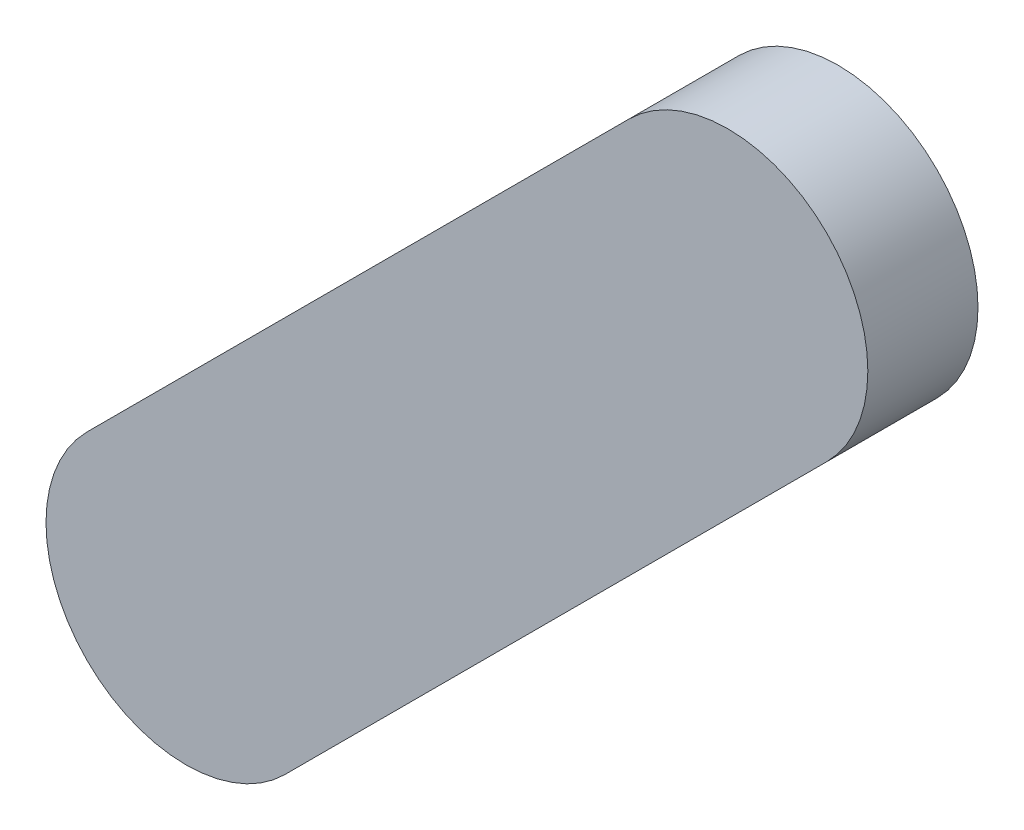
ISO-10303-21;
HEADER;
FILE_DESCRIPTION(('STEP AP214'),'2;1');
FILE_NAME('part.step','',(''),(''),'','','');
FILE_SCHEMA(('AUTOMOTIVE_DESIGN { 1 0 10303 214 1 1 1 1 }'));
ENDSEC;
DATA;
#1=APPLICATION_CONTEXT('core data for automotive mechanical design processes');
#2=APPLICATION_PROTOCOL_DEFINITION('international standard','automotive_design',2000,#1);
#3=PRODUCT_CONTEXT('',#1,'mechanical');
#4=PRODUCT('Part','Part','',(#3));
#5=PRODUCT_RELATED_PRODUCT_CATEGORY('part','',(#4));
#6=PRODUCT_DEFINITION_FORMATION('','',#4);
#7=PRODUCT_DEFINITION_CONTEXT('part definition',#1,'design');
#8=PRODUCT_DEFINITION('design','',#6,#7);
#9=PRODUCT_DEFINITION_SHAPE('','',#8);
#10=(LENGTH_UNIT() NAMED_UNIT(*) SI_UNIT(.MILLI.,.METRE.));
#11=(NAMED_UNIT(*) PLANE_ANGLE_UNIT() SI_UNIT($,.RADIAN.));
#12=(NAMED_UNIT(*) SI_UNIT($,.STERADIAN.) SOLID_ANGLE_UNIT());
#13=UNCERTAINTY_MEASURE_WITH_UNIT(LENGTH_MEASURE(1.E-05),#10,'distance_accuracy_value','');
#14=(GEOMETRIC_REPRESENTATION_CONTEXT(3) GLOBAL_UNCERTAINTY_ASSIGNED_CONTEXT((#13)) GLOBAL_UNIT_ASSIGNED_CONTEXT((#10,
#11,#12)) REPRESENTATION_CONTEXT('',''));
#15=CARTESIAN_POINT('',(0.,0.,0.));
#16=DIRECTION('',(0.,0.,1.));
#17=DIRECTION('',(1.,0.,0.));
#18=AXIS2_PLACEMENT_3D('',#15,#16,#17);
#19=CARTESIAN_POINT('',(131.8976026,58.85639486,0.));
#20=DIRECTION('',(-0.707106781186548,0.707106781186548,0.));
#21=DIRECTION('',(0.707106781186548,0.707106781186548,0.));
#22=AXIS2_PLACEMENT_3D('',#19,#20,#21);
#23=PLANE('',#22);
#24=DIRECTION('',(0.707106781186548,0.707106781186548,0.));
#25=VECTOR('',#24,1.);
#26=CARTESIAN_POINT('',(131.8976026,58.85639486,0.1999996));
#27=LINE('',#26,#25);
#28=CARTESIAN_POINT('',(131.8976026,58.85639486,0.1999996));
#29=VERTEX_POINT('',#28);
#30=CARTESIAN_POINT('',(132.88180434,59.8405966,0.1999996));
#31=VERTEX_POINT('',#30);
#32=EDGE_CURVE('E11',#29,#31,#27,.T.);
#33=ORIENTED_EDGE('',*,*,#32,.F.);
#34=DIRECTION('',(0.,0.,1.));
#35=VECTOR('',#34,1.);
#36=CARTESIAN_POINT('',(131.8976026,58.85639486,0.));
#37=LINE('',#36,#35);
#38=CARTESIAN_POINT('',(131.8976026,58.85639486,0.));
#39=VERTEX_POINT('',#38);
#40=EDGE_CURVE('E24',#39,#29,#37,.T.);
#41=ORIENTED_EDGE('',*,*,#40,.F.);
#42=DIRECTION('',(0.707106781186548,0.707106781186548,0.));
#43=VECTOR('',#42,1.);
#44=CARTESIAN_POINT('',(131.8976026,58.85639486,0.));
#45=LINE('',#44,#43);
#46=CARTESIAN_POINT('',(132.88180434,59.8405966,0.));
#47=VERTEX_POINT('',#46);
#48=EDGE_CURVE('E75',#39,#47,#45,.T.);
#49=ORIENTED_EDGE('',*,*,#48,.T.);
#50=DIRECTION('',(0.,0.,1.));
#51=VECTOR('',#50,1.);
#52=CARTESIAN_POINT('',(132.88180434,59.8405966,0.));
#53=LINE('',#52,#51);
#54=EDGE_CURVE('E37',#47,#31,#53,.T.);
#55=ORIENTED_EDGE('',*,*,#54,.T.);
#56=EDGE_LOOP('',(#33,#41,#49,#55));
#57=FACE_BOUND('',#56,.T.);
#58=ADVANCED_FACE('F17',(#57),#23,.F.);
#59=CARTESIAN_POINT('',(132.70219967,60.02020127,0.));
#60=DIRECTION('',(0.,0.,-1.));
#61=DIRECTION('',(0.707106781186562,-0.707106781186534,0.));
#62=AXIS2_PLACEMENT_3D('',#59,#60,#61);
#63=CYLINDRICAL_SURFACE('',#62,0.253999360179541);
#64=CARTESIAN_POINT('',(132.70219967,60.02020127,0.1999996));
#65=DIRECTION('',(0.,0.,1.));
#66=DIRECTION('',(0.707106781186562,-0.707106781186534,0.));
#67=AXIS2_PLACEMENT_3D('',#64,#65,#66);
#68=CIRCLE('',#67,0.253999360179541);
#69=CARTESIAN_POINT('',(132.522595,60.19980594,0.1999996));
#70=VERTEX_POINT('',#69);
#71=EDGE_CURVE('E83',#31,#70,#68,.T.);
#72=ORIENTED_EDGE('',*,*,#71,.F.);
#73=ORIENTED_EDGE('',*,*,#54,.F.);
#74=CARTESIAN_POINT('',(132.70219967,60.02020127,0.));
#75=DIRECTION('',(0.,0.,1.));
#76=DIRECTION('',(0.707106781186562,-0.707106781186534,0.));
#77=AXIS2_PLACEMENT_3D('',#74,#75,#76);
#78=CIRCLE('',#77,0.253999360179541);
#79=CARTESIAN_POINT('',(132.522595,60.19980594,0.));
#80=VERTEX_POINT('',#79);
#81=EDGE_CURVE('E81',#47,#80,#78,.T.);
#82=ORIENTED_EDGE('',*,*,#81,.T.);
#83=DIRECTION('',(0.,0.,1.));
#84=VECTOR('',#83,1.);
#85=CARTESIAN_POINT('',(132.522595,60.19980594,0.));
#86=LINE('',#85,#84);
#87=EDGE_CURVE('E67',#80,#70,#86,.T.);
#88=ORIENTED_EDGE('',*,*,#87,.T.);
#89=EDGE_LOOP('',(#72,#73,#82,#88));
#90=FACE_BOUND('',#89,.T.);
#91=ADVANCED_FACE('F89',(#90),#63,.T.);
#92=CARTESIAN_POINT('',(132.522595,60.19980594,0.));
#93=DIRECTION('',(0.707106781186548,-0.707106781186548,0.));
#94=DIRECTION('',(-0.707106781186548,-0.707106781186548,0.));
#95=AXIS2_PLACEMENT_3D('',#92,#93,#94);
#96=PLANE('',#95);
#97=DIRECTION('',(-0.707106781186548,-0.707106781186548,0.));
#98=VECTOR('',#97,1.);
#99=CARTESIAN_POINT('',(132.522595,60.19980594,0.1999996));
#100=LINE('',#99,#98);
#101=CARTESIAN_POINT('',(131.53839326,59.2156042,0.1999996));
#102=VERTEX_POINT('',#101);
#103=EDGE_CURVE('E71',#70,#102,#100,.T.);
#104=ORIENTED_EDGE('',*,*,#103,.F.);
#105=ORIENTED_EDGE('',*,*,#87,.F.);
#106=DIRECTION('',(-0.707106781186548,-0.707106781186548,0.));
#107=VECTOR('',#106,1.);
#108=CARTESIAN_POINT('',(132.522595,60.19980594,0.));
#109=LINE('',#108,#107);
#110=CARTESIAN_POINT('',(131.53839326,59.2156042,0.));
#111=VERTEX_POINT('',#110);
#112=EDGE_CURVE('E63',#80,#111,#109,.T.);
#113=ORIENTED_EDGE('',*,*,#112,.T.);
#114=DIRECTION('',(0.,0.,1.));
#115=VECTOR('',#114,1.);
#116=CARTESIAN_POINT('',(131.53839326,59.2156042,0.));
#117=LINE('',#116,#115);
#118=EDGE_CURVE('E53',#111,#102,#117,.T.);
#119=ORIENTED_EDGE('',*,*,#118,.T.);
#120=EDGE_LOOP('',(#104,#105,#113,#119));
#121=FACE_BOUND('',#120,.T.);
#122=ADVANCED_FACE('F66',(#121),#96,.F.);
#123=CARTESIAN_POINT('',(131.71799793,59.03599953,0.));
#124=DIRECTION('',(0.,0.,-1.));
#125=DIRECTION('',(-0.707106781186492,0.707106781186603,0.));
#126=AXIS2_PLACEMENT_3D('',#123,#124,#125);
#127=CYLINDRICAL_SURFACE('',#126,0.253999360179532);
#128=CARTESIAN_POINT('',(131.71799793,59.03599953,0.1999996));
#129=DIRECTION('',(0.,0.,1.));
#130=DIRECTION('',(-0.707106781186492,0.707106781186603,0.));
#131=AXIS2_PLACEMENT_3D('',#128,#129,#130);
#132=CIRCLE('',#131,0.253999360179532);
#133=EDGE_CURVE('E59',#102,#29,#132,.T.);
#134=ORIENTED_EDGE('',*,*,#133,.F.);
#135=ORIENTED_EDGE('',*,*,#118,.F.);
#136=CARTESIAN_POINT('',(131.71799793,59.03599953,0.));
#137=DIRECTION('',(0.,0.,1.));
#138=DIRECTION('',(-0.707106781186492,0.707106781186603,0.));
#139=AXIS2_PLACEMENT_3D('',#136,#137,#138);
#140=CIRCLE('',#139,0.253999360179532);
#141=EDGE_CURVE('E57',#111,#39,#140,.T.);
#142=ORIENTED_EDGE('',*,*,#141,.T.);
#143=ORIENTED_EDGE('',*,*,#40,.T.);
#144=EDGE_LOOP('',(#134,#135,#142,#143));
#145=FACE_BOUND('',#144,.T.);
#146=ADVANCED_FACE('F55',(#145),#127,.T.);
#147=CARTESIAN_POINT('',(131.8976026,58.85639486,0.));
#148=DIRECTION('',(0.,0.,-1.));
#149=DIRECTION('',(-1.,0.,0.));
#150=AXIS2_PLACEMENT_3D('',#147,#148,#149);
#151=PLANE('',#150);
#152=ORIENTED_EDGE('',*,*,#141,.F.);
#153=ORIENTED_EDGE('',*,*,#112,.F.);
#154=ORIENTED_EDGE('',*,*,#81,.F.);
#155=ORIENTED_EDGE('',*,*,#48,.F.);
#156=EDGE_LOOP('',(#152,#153,#154,#155));
#157=FACE_BOUND('',#156,.T.);
#158=ADVANCED_FACE('F74',(#157),#151,.T.);
#159=CARTESIAN_POINT('',(131.8976026,58.85639486,0.1999996));
#160=DIRECTION('',(0.,0.,-1.));
#161=DIRECTION('',(-1.,0.,0.));
#162=AXIS2_PLACEMENT_3D('',#159,#160,#161);
#163=PLANE('',#162);
#164=ORIENTED_EDGE('',*,*,#32,.T.);
#165=ORIENTED_EDGE('',*,*,#71,.T.);
#166=ORIENTED_EDGE('',*,*,#103,.T.);
#167=ORIENTED_EDGE('',*,*,#133,.T.);
#168=EDGE_LOOP('',(#164,#165,#166,#167));
#169=FACE_BOUND('',#168,.T.);
#170=ADVANCED_FACE('F91',(#169),#163,.F.);
#171=CLOSED_SHELL('',(#58,#91,#122,#146,#158,#170));
#172=MANIFOLD_SOLID_BREP('B1',#171);
#173=ADVANCED_BREP_SHAPE_REPRESENTATION('',(#18,#172),#14);
#174=SHAPE_DEFINITION_REPRESENTATION(#9,#173);
ENDSEC;
END-ISO-10303-21;
